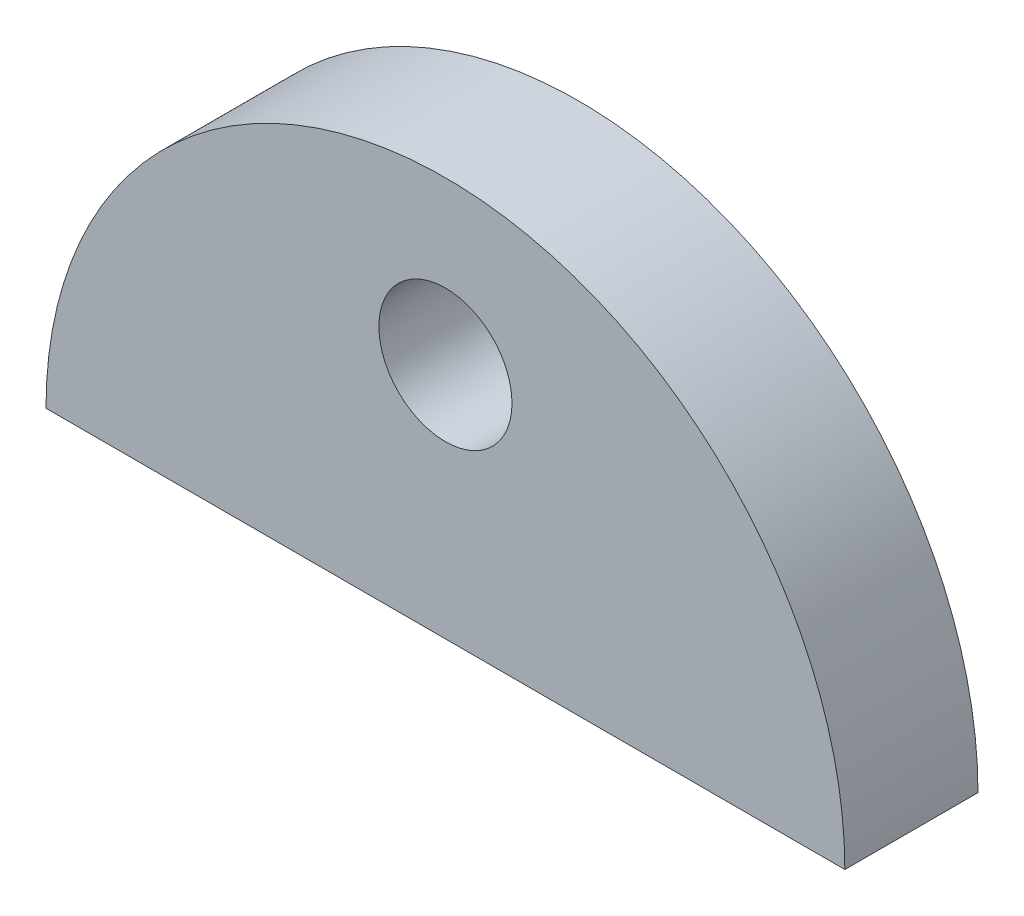
ISO-10303-21;
HEADER;
FILE_DESCRIPTION(('STEP AP214'),'2;1');
FILE_NAME('part.step','',(''),(''),'','','');
FILE_SCHEMA(('AUTOMOTIVE_DESIGN { 1 0 10303 214 1 1 1 1 }'));
ENDSEC;
DATA;
#1=APPLICATION_CONTEXT('core data for automotive mechanical design processes');
#2=APPLICATION_PROTOCOL_DEFINITION('international standard','automotive_design',2000,#1);
#3=PRODUCT_CONTEXT('',#1,'mechanical');
#4=PRODUCT('Part','Part','',(#3));
#5=PRODUCT_RELATED_PRODUCT_CATEGORY('part','',(#4));
#6=PRODUCT_DEFINITION_FORMATION('','',#4);
#7=PRODUCT_DEFINITION_CONTEXT('part definition',#1,'design');
#8=PRODUCT_DEFINITION('design','',#6,#7);
#9=PRODUCT_DEFINITION_SHAPE('','',#8);
#10=(LENGTH_UNIT() NAMED_UNIT(*) SI_UNIT(.MILLI.,.METRE.));
#11=(NAMED_UNIT(*) PLANE_ANGLE_UNIT() SI_UNIT($,.RADIAN.));
#12=(NAMED_UNIT(*) SI_UNIT($,.STERADIAN.) SOLID_ANGLE_UNIT());
#13=UNCERTAINTY_MEASURE_WITH_UNIT(LENGTH_MEASURE(1.E-05),#10,'distance_accuracy_value','');
#14=(GEOMETRIC_REPRESENTATION_CONTEXT(3) GLOBAL_UNCERTAINTY_ASSIGNED_CONTEXT((#13)) GLOBAL_UNIT_ASSIGNED_CONTEXT((#10,
#11,#12)) REPRESENTATION_CONTEXT('',''));
#15=CARTESIAN_POINT('',(0.,0.,0.));
#16=DIRECTION('',(0.,0.,1.));
#17=DIRECTION('',(1.,0.,0.));
#18=AXIS2_PLACEMENT_3D('',#15,#16,#17);
#19=CARTESIAN_POINT('',(-19.05,-3.94738793341794,7.9375));
#20=DIRECTION('',(0.,0.,-1.));
#21=DIRECTION('',(-1.,0.,0.));
#22=AXIS2_PLACEMENT_3D('',#19,#20,#21);
#23=PLANE('',#22);
#24=CARTESIAN_POINT('',(-19.05,-3.94738793341794,7.9375));
#25=DIRECTION('',(0.,0.,1.));
#26=DIRECTION('',(-1.,0.,0.));
#27=AXIS2_PLACEMENT_3D('',#24,#25,#26);
#28=CIRCLE('',#27,28.575);
#29=CARTESIAN_POINT('',(9.525,-3.94738793341793,7.9375));
#30=VERTEX_POINT('',#29);
#31=CARTESIAN_POINT('',(-47.625,-3.94738793341793,7.9375));
#32=VERTEX_POINT('',#31);
#33=EDGE_CURVE('E65',#30,#32,#28,.T.);
#34=ORIENTED_EDGE('',*,*,#33,.T.);
#35=DIRECTION('',(1.,0.,0.));
#36=VECTOR('',#35,1.);
#37=CARTESIAN_POINT('',(-47.625,-3.94738793341793,7.9375));
#38=LINE('',#37,#36);
#39=EDGE_CURVE('E50',#32,#30,#38,.T.);
#40=ORIENTED_EDGE('',*,*,#39,.T.);
#41=EDGE_LOOP('',(#34,#40));
#42=FACE_BOUND('',#41,.T.);
#43=CARTESIAN_POINT('',(-19.05,13.032747407111,7.9375));
#44=DIRECTION('',(0.,0.,1.));
#45=DIRECTION('',(1.,0.,0.));
#46=AXIS2_PLACEMENT_3D('',#43,#44,#45);
#47=CIRCLE('',#46,4.7625);
#48=CARTESIAN_POINT('',(-14.2875,13.032747407111,7.9375));
#49=VERTEX_POINT('',#48);
#50=EDGE_CURVE('E71',#49,#49,#47,.T.);
#51=ORIENTED_EDGE('',*,*,#50,.F.);
#52=EDGE_LOOP('',(#51));
#53=FACE_BOUND('',#52,.T.);
#54=ADVANCED_FACE('F34',(#42,#53),#23,.F.);
#55=CARTESIAN_POINT('',(-19.05,-3.94738793341794,-1.5875));
#56=DIRECTION('',(0.,0.,-1.));
#57=DIRECTION('',(-1.,0.,0.));
#58=AXIS2_PLACEMENT_3D('',#55,#56,#57);
#59=PLANE('',#58);
#60=CARTESIAN_POINT('',(-19.05,-3.94738793341794,-1.5875));
#61=DIRECTION('',(0.,0.,1.));
#62=DIRECTION('',(-1.,0.,0.));
#63=AXIS2_PLACEMENT_3D('',#60,#61,#62);
#64=CIRCLE('',#63,28.575);
#65=CARTESIAN_POINT('',(9.525,-3.94738793341793,-1.5875));
#66=VERTEX_POINT('',#65);
#67=CARTESIAN_POINT('',(-47.625,-3.94738793341793,-1.5875));
#68=VERTEX_POINT('',#67);
#69=EDGE_CURVE('E66',#66,#68,#64,.T.);
#70=ORIENTED_EDGE('',*,*,#69,.F.);
#71=DIRECTION('',(1.,0.,0.));
#72=VECTOR('',#71,1.);
#73=CARTESIAN_POINT('',(-47.625,-3.94738793341793,-1.5875));
#74=LINE('',#73,#72);
#75=EDGE_CURVE('E58',#68,#66,#74,.T.);
#76=ORIENTED_EDGE('',*,*,#75,.F.);
#77=EDGE_LOOP('',(#70,#76));
#78=FACE_BOUND('',#77,.T.);
#79=CARTESIAN_POINT('',(-19.05,13.032747407111,-1.5875));
#80=DIRECTION('',(0.,0.,1.));
#81=DIRECTION('',(1.,0.,0.));
#82=AXIS2_PLACEMENT_3D('',#79,#80,#81);
#83=CIRCLE('',#82,4.7625);
#84=CARTESIAN_POINT('',(-14.2875,13.032747407111,-1.5875));
#85=VERTEX_POINT('',#84);
#86=EDGE_CURVE('E74',#85,#85,#83,.T.);
#87=ORIENTED_EDGE('',*,*,#86,.T.);
#88=EDGE_LOOP('',(#87));
#89=FACE_BOUND('',#88,.T.);
#90=ADVANCED_FACE('F69',(#78,#89),#59,.T.);
#91=CARTESIAN_POINT('',(-19.05,-3.94738793341794,7.9375));
#92=DIRECTION('',(0.,0.,-1.));
#93=DIRECTION('',(-1.,0.,0.));
#94=AXIS2_PLACEMENT_3D('',#91,#92,#93);
#95=CYLINDRICAL_SURFACE('',#94,28.575);
#96=ORIENTED_EDGE('',*,*,#69,.T.);
#97=DIRECTION('',(0.,0.,-1.));
#98=VECTOR('',#97,1.);
#99=CARTESIAN_POINT('',(-47.625,-3.94738793341793,7.9375));
#100=LINE('',#99,#98);
#101=EDGE_CURVE('E11',#32,#68,#100,.T.);
#102=ORIENTED_EDGE('',*,*,#101,.F.);
#103=ORIENTED_EDGE('',*,*,#33,.F.);
#104=DIRECTION('',(0.,0.,-1.));
#105=VECTOR('',#104,1.);
#106=CARTESIAN_POINT('',(9.525,-3.94738793341793,7.9375));
#107=LINE('',#106,#105);
#108=EDGE_CURVE('E43',#30,#66,#107,.T.);
#109=ORIENTED_EDGE('',*,*,#108,.T.);
#110=EDGE_LOOP('',(#96,#102,#103,#109));
#111=FACE_BOUND('',#110,.T.);
#112=ADVANCED_FACE('F36',(#111),#95,.T.);
#113=CARTESIAN_POINT('',(-47.625,-3.94738793341793,7.9375));
#114=DIRECTION('',(0.,1.,0.));
#115=DIRECTION('',(0.,0.,1.));
#116=AXIS2_PLACEMENT_3D('',#113,#114,#115);
#117=PLANE('',#116);
#118=ORIENTED_EDGE('',*,*,#75,.T.);
#119=ORIENTED_EDGE('',*,*,#108,.F.);
#120=ORIENTED_EDGE('',*,*,#39,.F.);
#121=ORIENTED_EDGE('',*,*,#101,.T.);
#122=EDGE_LOOP('',(#118,#119,#120,#121));
#123=FACE_BOUND('',#122,.T.);
#124=ADVANCED_FACE('F61',(#123),#117,.F.);
#125=CARTESIAN_POINT('',(-19.05,13.032747407111,7.9375));
#126=DIRECTION('',(0.,0.,-1.));
#127=DIRECTION('',(-1.,0.,0.));
#128=AXIS2_PLACEMENT_3D('',#125,#126,#127);
#129=CYLINDRICAL_SURFACE('',#128,4.7625);
#130=ORIENTED_EDGE('',*,*,#50,.T.);
#131=EDGE_LOOP('',(#130));
#132=FACE_BOUND('',#131,.T.);
#133=ORIENTED_EDGE('',*,*,#86,.F.);
#134=EDGE_LOOP('',(#133));
#135=FACE_BOUND('',#134,.T.);
#136=ADVANCED_FACE('F82',(#132,#135),#129,.F.);
#137=CLOSED_SHELL('',(#54,#90,#112,#124,#136));
#138=MANIFOLD_SOLID_BREP('B2',#137);
#139=ADVANCED_BREP_SHAPE_REPRESENTATION('',(#18,#138),#14);
#140=SHAPE_DEFINITION_REPRESENTATION(#9,#139);
ENDSEC;
END-ISO-10303-21;
